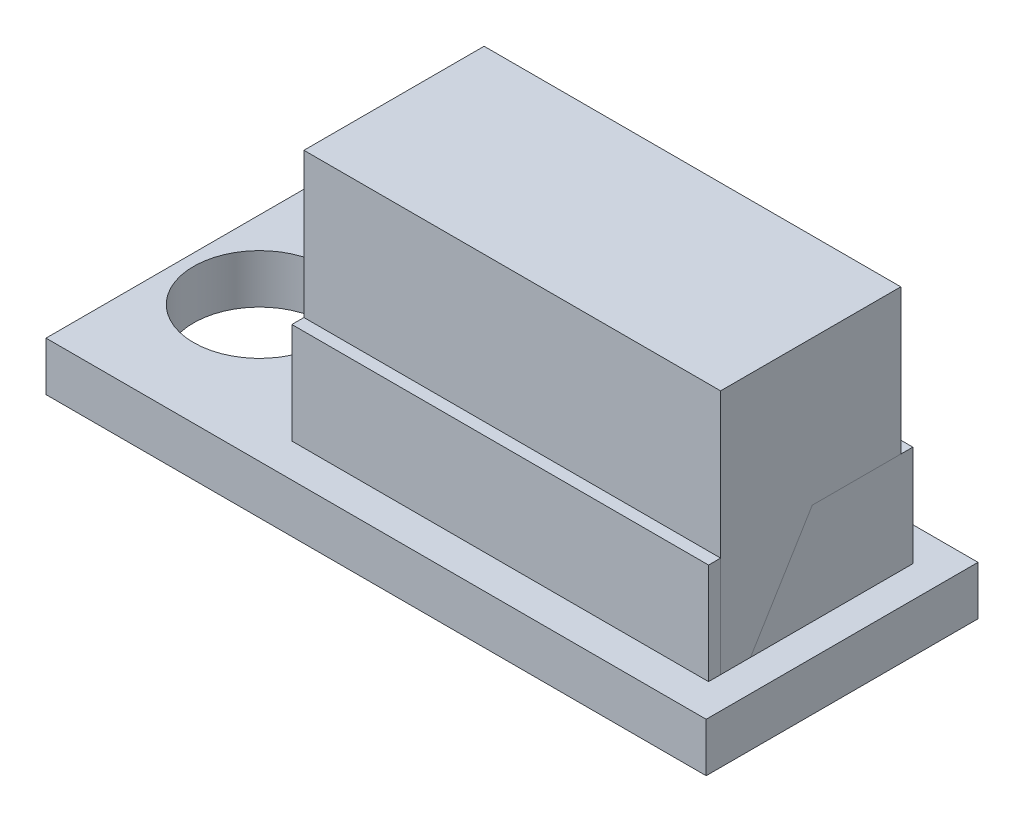
ISO-10303-21;
HEADER;
FILE_DESCRIPTION(('STEP AP214'),'2;1');
FILE_NAME('part.step','',(''),(''),'','','');
FILE_SCHEMA(('AUTOMOTIVE_DESIGN { 1 0 10303 214 1 1 1 1 }'));
ENDSEC;
DATA;
#1=APPLICATION_CONTEXT('core data for automotive mechanical design processes');
#2=APPLICATION_PROTOCOL_DEFINITION('international standard','automotive_design',2000,#1);
#3=PRODUCT_CONTEXT('',#1,'mechanical');
#4=PRODUCT('Part','Part','',(#3));
#5=PRODUCT_RELATED_PRODUCT_CATEGORY('part','',(#4));
#6=PRODUCT_DEFINITION_FORMATION('','',#4);
#7=PRODUCT_DEFINITION_CONTEXT('part definition',#1,'design');
#8=PRODUCT_DEFINITION('design','',#6,#7);
#9=PRODUCT_DEFINITION_SHAPE('','',#8);
#10=(LENGTH_UNIT() NAMED_UNIT(*) SI_UNIT(.MILLI.,.METRE.));
#11=(NAMED_UNIT(*) PLANE_ANGLE_UNIT() SI_UNIT($,.RADIAN.));
#12=(NAMED_UNIT(*) SI_UNIT($,.STERADIAN.) SOLID_ANGLE_UNIT());
#13=UNCERTAINTY_MEASURE_WITH_UNIT(LENGTH_MEASURE(1.E-05),#10,'distance_accuracy_value','');
#14=(GEOMETRIC_REPRESENTATION_CONTEXT(3) GLOBAL_UNCERTAINTY_ASSIGNED_CONTEXT((#13)) GLOBAL_UNIT_ASSIGNED_CONTEXT((#10,
#11,#12)) REPRESENTATION_CONTEXT('',''));
#15=CARTESIAN_POINT('',(0.,0.,0.));
#16=DIRECTION('',(0.,0.,1.));
#17=DIRECTION('',(1.,0.,0.));
#18=AXIS2_PLACEMENT_3D('',#15,#16,#17);
#19=CARTESIAN_POINT('',(-44.7585645073612,9.6393,17.5900974714582));
#20=DIRECTION('',(1.,0.,0.));
#21=DIRECTION('',(0.,0.,-1.));
#22=AXIS2_PLACEMENT_3D('',#19,#20,#21);
#23=PLANE('',#22);
#24=DIRECTION('',(0.,0.,1.));
#25=VECTOR('',#24,1.);
#26=CARTESIAN_POINT('',(-44.7585645073612,0.,17.5900974714582));
#27=LINE('',#26,#25);
#28=CARTESIAN_POINT('',(-44.7585645073612,0.,17.5900974714582));
#29=VERTEX_POINT('',#28);
#30=CARTESIAN_POINT('',(-44.7585645073612,0.,23.4828974714582));
#31=VERTEX_POINT('',#30);
#32=EDGE_CURVE('E105',#29,#31,#27,.T.);
#33=ORIENTED_EDGE('',*,*,#32,.T.);
#34=DIRECTION('',(0.,-1.,0.));
#35=VECTOR('',#34,1.);
#36=CARTESIAN_POINT('',(-44.7585645073612,9.6393,23.4828974714582));
#37=LINE('',#36,#35);
#38=CARTESIAN_POINT('',(-44.7585645073612,9.6393,23.4828974714582));
#39=VERTEX_POINT('',#38);
#40=EDGE_CURVE('E12',#39,#31,#37,.T.);
#41=ORIENTED_EDGE('',*,*,#40,.F.);
#42=DIRECTION('',(0.,0.,1.));
#43=VECTOR('',#42,1.);
#44=CARTESIAN_POINT('',(-44.7585645073612,9.6393,17.5900974714582));
#45=LINE('',#44,#43);
#46=CARTESIAN_POINT('',(-44.7585645073612,9.6393,17.5900974714582));
#47=VERTEX_POINT('',#46);
#48=EDGE_CURVE('E93',#47,#39,#45,.T.);
#49=ORIENTED_EDGE('',*,*,#48,.F.);
#50=DIRECTION('',(0.,-1.,0.));
#51=VECTOR('',#50,1.);
#52=CARTESIAN_POINT('',(-44.7585645073612,9.6393,17.5900974714582));
#53=LINE('',#52,#51);
#54=EDGE_CURVE('E101',#47,#29,#53,.T.);
#55=ORIENTED_EDGE('',*,*,#54,.T.);
#56=EDGE_LOOP('',(#33,#41,#49,#55));
#57=FACE_BOUND('',#56,.T.);
#58=ADVANCED_FACE('F42',(#57),#23,.F.);
#59=CARTESIAN_POINT('',(-44.7585645073612,9.6393,23.4828974714582));
#60=DIRECTION('',(0.,0.,-1.));
#61=DIRECTION('',(-1.,0.,0.));
#62=AXIS2_PLACEMENT_3D('',#59,#60,#61);
#63=PLANE('',#62);
#64=DIRECTION('',(1.,0.,0.));
#65=VECTOR('',#64,1.);
#66=CARTESIAN_POINT('',(-44.7585645073612,0.,23.4828974714582));
#67=LINE('',#66,#65);
#68=CARTESIAN_POINT('',(-31.1314645073612,0.,23.4828974714582));
#69=VERTEX_POINT('',#68);
#70=EDGE_CURVE('E97',#31,#69,#67,.T.);
#71=ORIENTED_EDGE('',*,*,#70,.T.);
#72=DIRECTION('',(0.,-1.,0.));
#73=VECTOR('',#72,1.);
#74=CARTESIAN_POINT('',(-31.1314645073612,9.6393,23.4828974714582));
#75=LINE('',#74,#73);
#76=CARTESIAN_POINT('',(-31.1314645073612,9.6393,23.4828974714582));
#77=VERTEX_POINT('',#76);
#78=EDGE_CURVE('E50',#77,#69,#75,.T.);
#79=ORIENTED_EDGE('',*,*,#78,.F.);
#80=DIRECTION('',(1.,0.,0.));
#81=VECTOR('',#80,1.);
#82=CARTESIAN_POINT('',(-44.7585645073612,9.6393,23.4828974714582));
#83=LINE('',#82,#81);
#84=EDGE_CURVE('E88',#39,#77,#83,.T.);
#85=ORIENTED_EDGE('',*,*,#84,.F.);
#86=ORIENTED_EDGE('',*,*,#40,.T.);
#87=EDGE_LOOP('',(#71,#79,#85,#86));
#88=FACE_BOUND('',#87,.T.);
#89=ADVANCED_FACE('F96',(#88),#63,.F.);
#90=CARTESIAN_POINT('',(-31.1314645073612,9.6393,17.5900974714582));
#91=DIRECTION('',(-1.,0.,0.));
#92=DIRECTION('',(0.,0.,1.));
#93=AXIS2_PLACEMENT_3D('',#90,#91,#92);
#94=PLANE('',#93);
#95=DIRECTION('',(0.,0.,-1.));
#96=VECTOR('',#95,1.);
#97=CARTESIAN_POINT('',(-31.1314645073612,0.,17.5900974714582));
#98=LINE('',#97,#96);
#99=CARTESIAN_POINT('',(-31.1314645073612,0.,17.5900974714582));
#100=VERTEX_POINT('',#99);
#101=EDGE_CURVE('E75',#69,#100,#98,.T.);
#102=ORIENTED_EDGE('',*,*,#101,.T.);
#103=DIRECTION('',(0.,-1.,0.));
#104=VECTOR('',#103,1.);
#105=CARTESIAN_POINT('',(-31.1314645073612,9.6393,17.5900974714582));
#106=LINE('',#105,#104);
#107=CARTESIAN_POINT('',(-31.1314645073612,9.6393,17.5900974714582));
#108=VERTEX_POINT('',#107);
#109=EDGE_CURVE('E98',#108,#100,#106,.T.);
#110=ORIENTED_EDGE('',*,*,#109,.F.);
#111=DIRECTION('',(0.,0.,-1.));
#112=VECTOR('',#111,1.);
#113=CARTESIAN_POINT('',(-31.1314645073612,9.6393,17.5900974714582));
#114=LINE('',#113,#112);
#115=EDGE_CURVE('E91',#77,#108,#114,.T.);
#116=ORIENTED_EDGE('',*,*,#115,.F.);
#117=ORIENTED_EDGE('',*,*,#78,.T.);
#118=EDGE_LOOP('',(#102,#110,#116,#117));
#119=FACE_BOUND('',#118,.T.);
#120=ADVANCED_FACE('F99',(#119),#94,.F.);
#121=CARTESIAN_POINT('',(-44.7585645073612,9.6393,17.5900974714582));
#122=DIRECTION('',(0.,0.,1.));
#123=DIRECTION('',(1.,0.,0.));
#124=AXIS2_PLACEMENT_3D('',#121,#122,#123);
#125=PLANE('',#124);
#126=DIRECTION('',(-1.,0.,0.));
#127=VECTOR('',#126,1.);
#128=CARTESIAN_POINT('',(-44.7585645073612,0.,17.5900974714582));
#129=LINE('',#128,#127);
#130=EDGE_CURVE('E81',#100,#29,#129,.T.);
#131=ORIENTED_EDGE('',*,*,#130,.T.);
#132=ORIENTED_EDGE('',*,*,#54,.F.);
#133=DIRECTION('',(-1.,0.,0.));
#134=VECTOR('',#133,1.);
#135=CARTESIAN_POINT('',(-44.7585645073612,9.6393,17.5900974714582));
#136=LINE('',#135,#134);
#137=EDGE_CURVE('E58',#108,#47,#136,.T.);
#138=ORIENTED_EDGE('',*,*,#137,.F.);
#139=ORIENTED_EDGE('',*,*,#109,.T.);
#140=EDGE_LOOP('',(#131,#132,#138,#139));
#141=FACE_BOUND('',#140,.T.);
#142=ADVANCED_FACE('F112',(#141),#125,.F.);
#143=CARTESIAN_POINT('',(0.,9.6393,0.));
#144=DIRECTION('',(0.,1.,0.));
#145=DIRECTION('',(0.,0.,1.));
#146=AXIS2_PLACEMENT_3D('',#143,#144,#145);
#147=PLANE('',#146);
#148=ORIENTED_EDGE('',*,*,#48,.T.);
#149=ORIENTED_EDGE('',*,*,#84,.T.);
#150=ORIENTED_EDGE('',*,*,#115,.T.);
#151=ORIENTED_EDGE('',*,*,#137,.T.);
#152=EDGE_LOOP('',(#148,#149,#150,#151));
#153=FACE_BOUND('',#152,.T.);
#154=ADVANCED_FACE('F89',(#153),#147,.T.);
#155=CARTESIAN_POINT('',(0.,0.,0.));
#156=DIRECTION('',(0.,1.,0.));
#157=DIRECTION('',(0.,0.,1.));
#158=AXIS2_PLACEMENT_3D('',#155,#156,#157);
#159=PLANE('',#158);
#160=ORIENTED_EDGE('',*,*,#32,.F.);
#161=ORIENTED_EDGE('',*,*,#130,.F.);
#162=ORIENTED_EDGE('',*,*,#101,.F.);
#163=ORIENTED_EDGE('',*,*,#70,.F.);
#164=EDGE_LOOP('',(#160,#161,#162,#163));
#165=FACE_BOUND('',#164,.T.);
#166=ADVANCED_FACE('F115',(#165),#159,.F.);
#167=CLOSED_SHELL('',(#58,#89,#120,#142,#154,#166));
#168=MANIFOLD_SOLID_BREP('B2',#167);
#169=CARTESIAN_POINT('',(0.,1.6002,0.));
#170=DIRECTION('',(0.,1.,0.));
#171=DIRECTION('',(0.,0.,1.));
#172=AXIS2_PLACEMENT_3D('',#169,#170,#171);
#173=PLANE('',#172);
#174=CARTESIAN_POINT('',(-49.1549913910025,1.6002,20.5364974714582));
#175=DIRECTION('',(0.,1.,0.));
#176=DIRECTION('',(0.,0.,1.));
#177=AXIS2_PLACEMENT_3D('',#174,#175,#176);
#178=CIRCLE('',#177,2.159);
#179=CARTESIAN_POINT('',(-49.1549913910025,1.6002,22.6954974714582));
#180=VERTEX_POINT('',#179);
#181=EDGE_CURVE('E277',#180,#180,#178,.T.);
#182=ORIENTED_EDGE('',*,*,#181,.F.);
#183=EDGE_LOOP('',(#182));
#184=FACE_BOUND('',#183,.T.);
#185=DIRECTION('',(0.,0.,1.));
#186=VECTOR('',#185,1.);
#187=CARTESIAN_POINT('',(-51.6949913910025,1.6002,16.0914974714582));
#188=LINE('',#187,#186);
#189=CARTESIAN_POINT('',(-51.6949913910025,1.6002,16.0914974714582));
#190=VERTEX_POINT('',#189);
#191=CARTESIAN_POINT('',(-51.6949913910025,1.6002,24.9814974714582));
#192=VERTEX_POINT('',#191);
#193=EDGE_CURVE('E283',#190,#192,#188,.T.);
#194=ORIENTED_EDGE('',*,*,#193,.T.);
#195=DIRECTION('',(1.,0.,0.));
#196=VECTOR('',#195,1.);
#197=CARTESIAN_POINT('',(-51.6949913910025,1.6002,24.9814974714582));
#198=LINE('',#197,#196);
#199=CARTESIAN_POINT('',(-30.1049913910025,1.6002,24.9814974714582));
#200=VERTEX_POINT('',#199);
#201=EDGE_CURVE('E217',#192,#200,#198,.T.);
#202=ORIENTED_EDGE('',*,*,#201,.T.);
#203=DIRECTION('',(0.,0.,-1.));
#204=VECTOR('',#203,1.);
#205=CARTESIAN_POINT('',(-30.1049913910025,1.6002,16.0914974714582));
#206=LINE('',#205,#204);
#207=CARTESIAN_POINT('',(-30.1049913910025,1.6002,16.0914974714582));
#208=VERTEX_POINT('',#207);
#209=EDGE_CURVE('E286',#200,#208,#206,.T.);
#210=ORIENTED_EDGE('',*,*,#209,.T.);
#211=DIRECTION('',(-1.,0.,0.));
#212=VECTOR('',#211,1.);
#213=CARTESIAN_POINT('',(-51.6949913910025,1.6002,16.0914974714582));
#214=LINE('',#213,#212);
#215=EDGE_CURVE('E189',#208,#190,#214,.T.);
#216=ORIENTED_EDGE('',*,*,#215,.T.);
#217=EDGE_LOOP('',(#194,#202,#210,#216));
#218=FACE_BOUND('',#217,.T.);
#219=DIRECTION('',(1.,0.,0.));
#220=VECTOR('',#219,1.);
#221=CARTESIAN_POINT('',(0.,1.6002,17.1963974714582));
#222=LINE('',#221,#220);
#223=CARTESIAN_POINT('',(-44.7585645073612,1.6002,17.1963974714582));
#224=VERTEX_POINT('',#223);
#225=CARTESIAN_POINT('',(-31.1314645073612,1.6002,17.1963974714582));
#226=VERTEX_POINT('',#225);
#227=EDGE_CURVE('E273',#224,#226,#222,.T.);
#228=ORIENTED_EDGE('',*,*,#227,.T.);
#229=DIRECTION('',(0.,0.,1.));
#230=VECTOR('',#229,1.);
#231=CARTESIAN_POINT('',(-31.1314645073612,1.6002,0.));
#232=LINE('',#231,#230);
#233=CARTESIAN_POINT('',(-31.1314645073612,1.6002,23.8765974714582));
#234=VERTEX_POINT('',#233);
#235=EDGE_CURVE('E262',#226,#234,#232,.T.);
#236=ORIENTED_EDGE('',*,*,#235,.T.);
#237=DIRECTION('',(-1.,0.,0.));
#238=VECTOR('',#237,1.);
#239=CARTESIAN_POINT('',(0.,1.6002,23.8765974714582));
#240=LINE('',#239,#238);
#241=CARTESIAN_POINT('',(-44.7585645073612,1.6002,23.8765974714582));
#242=VERTEX_POINT('',#241);
#243=EDGE_CURVE('E263',#234,#242,#240,.T.);
#244=ORIENTED_EDGE('',*,*,#243,.T.);
#245=DIRECTION('',(0.,0.,-1.));
#246=VECTOR('',#245,1.);
#247=CARTESIAN_POINT('',(-44.7585645073612,1.6002,0.));
#248=LINE('',#247,#246);
#249=EDGE_CURVE('E266',#242,#224,#248,.T.);
#250=ORIENTED_EDGE('',*,*,#249,.T.);
#251=EDGE_LOOP('',(#228,#236,#244,#250));
#252=FACE_BOUND('',#251,.T.);
#253=ADVANCED_FACE('F165',(#184,#218,#252),#173,.T.);
#254=CARTESIAN_POINT('',(0.,0.,0.));
#255=DIRECTION('',(0.,1.,0.));
#256=DIRECTION('',(0.,0.,1.));
#257=AXIS2_PLACEMENT_3D('',#254,#255,#256);
#258=PLANE('',#257);
#259=CARTESIAN_POINT('',(-49.1549913910025,0.,20.5364974714582));
#260=DIRECTION('',(0.,1.,0.));
#261=DIRECTION('',(0.,0.,1.));
#262=AXIS2_PLACEMENT_3D('',#259,#260,#261);
#263=CIRCLE('',#262,2.159);
#264=CARTESIAN_POINT('',(-49.1549913910025,0.,22.6954974714582));
#265=VERTEX_POINT('',#264);
#266=EDGE_CURVE('E276',#265,#265,#263,.T.);
#267=ORIENTED_EDGE('',*,*,#266,.T.);
#268=EDGE_LOOP('',(#267));
#269=FACE_BOUND('',#268,.T.);
#270=DIRECTION('',(0.,0.,1.));
#271=VECTOR('',#270,1.);
#272=CARTESIAN_POINT('',(-51.6949913910025,0.,16.0914974714582));
#273=LINE('',#272,#271);
#274=CARTESIAN_POINT('',(-51.6949913910025,0.,16.0914974714582));
#275=VERTEX_POINT('',#274);
#276=CARTESIAN_POINT('',(-51.6949913910025,0.,24.9814974714582));
#277=VERTEX_POINT('',#276);
#278=EDGE_CURVE('E280',#275,#277,#273,.T.);
#279=ORIENTED_EDGE('',*,*,#278,.F.);
#280=DIRECTION('',(-1.,0.,0.));
#281=VECTOR('',#280,1.);
#282=CARTESIAN_POINT('',(-51.6949913910025,0.,16.0914974714582));
#283=LINE('',#282,#281);
#284=CARTESIAN_POINT('',(-30.1049913910025,0.,16.0914974714582));
#285=VERTEX_POINT('',#284);
#286=EDGE_CURVE('E210',#285,#275,#283,.T.);
#287=ORIENTED_EDGE('',*,*,#286,.F.);
#288=DIRECTION('',(0.,0.,-1.));
#289=VECTOR('',#288,1.);
#290=CARTESIAN_POINT('',(-30.1049913910025,0.,16.0914974714582));
#291=LINE('',#290,#289);
#292=CARTESIAN_POINT('',(-30.1049913910025,0.,24.9814974714582));
#293=VERTEX_POINT('',#292);
#294=EDGE_CURVE('E294',#293,#285,#291,.T.);
#295=ORIENTED_EDGE('',*,*,#294,.F.);
#296=DIRECTION('',(1.,0.,0.));
#297=VECTOR('',#296,1.);
#298=CARTESIAN_POINT('',(-51.6949913910025,0.,24.9814974714582));
#299=LINE('',#298,#297);
#300=EDGE_CURVE('E292',#277,#293,#299,.T.);
#301=ORIENTED_EDGE('',*,*,#300,.F.);
#302=EDGE_LOOP('',(#279,#287,#295,#301));
#303=FACE_BOUND('',#302,.T.);
#304=ADVANCED_FACE('F307',(#269,#303),#258,.F.);
#305=CARTESIAN_POINT('',(-51.6949913910025,1.6002,16.0914974714582));
#306=DIRECTION('',(1.,0.,0.));
#307=DIRECTION('',(0.,0.,-1.));
#308=AXIS2_PLACEMENT_3D('',#305,#306,#307);
#309=PLANE('',#308);
#310=ORIENTED_EDGE('',*,*,#278,.T.);
#311=DIRECTION('',(0.,-1.,0.));
#312=VECTOR('',#311,1.);
#313=CARTESIAN_POINT('',(-51.6949913910025,1.6002,24.9814974714582));
#314=LINE('',#313,#312);
#315=EDGE_CURVE('E40',#192,#277,#314,.T.);
#316=ORIENTED_EDGE('',*,*,#315,.F.);
#317=ORIENTED_EDGE('',*,*,#193,.F.);
#318=DIRECTION('',(0.,-1.,0.));
#319=VECTOR('',#318,1.);
#320=CARTESIAN_POINT('',(-51.6949913910025,1.6002,16.0914974714582));
#321=LINE('',#320,#319);
#322=EDGE_CURVE('E289',#190,#275,#321,.T.);
#323=ORIENTED_EDGE('',*,*,#322,.T.);
#324=EDGE_LOOP('',(#310,#316,#317,#323));
#325=FACE_BOUND('',#324,.T.);
#326=ADVANCED_FACE('F167',(#325),#309,.F.);
#327=CARTESIAN_POINT('',(-51.6949913910025,1.6002,24.9814974714582));
#328=DIRECTION('',(0.,0.,-1.));
#329=DIRECTION('',(-1.,0.,0.));
#330=AXIS2_PLACEMENT_3D('',#327,#328,#329);
#331=PLANE('',#330);
#332=ORIENTED_EDGE('',*,*,#300,.T.);
#333=DIRECTION('',(0.,-1.,0.));
#334=VECTOR('',#333,1.);
#335=CARTESIAN_POINT('',(-30.1049913910025,1.6002,24.9814974714582));
#336=LINE('',#335,#334);
#337=EDGE_CURVE('E173',#200,#293,#336,.T.);
#338=ORIENTED_EDGE('',*,*,#337,.F.);
#339=ORIENTED_EDGE('',*,*,#201,.F.);
#340=ORIENTED_EDGE('',*,*,#315,.T.);
#341=EDGE_LOOP('',(#332,#338,#339,#340));
#342=FACE_BOUND('',#341,.T.);
#343=ADVANCED_FACE('F321',(#342),#331,.F.);
#344=CARTESIAN_POINT('',(-30.1049913910025,1.6002,16.0914974714582));
#345=DIRECTION('',(-1.,0.,0.));
#346=DIRECTION('',(0.,0.,1.));
#347=AXIS2_PLACEMENT_3D('',#344,#345,#346);
#348=PLANE('',#347);
#349=ORIENTED_EDGE('',*,*,#294,.T.);
#350=DIRECTION('',(0.,-1.,0.));
#351=VECTOR('',#350,1.);
#352=CARTESIAN_POINT('',(-30.1049913910025,1.6002,16.0914974714582));
#353=LINE('',#352,#351);
#354=EDGE_CURVE('E298',#208,#285,#353,.T.);
#355=ORIENTED_EDGE('',*,*,#354,.F.);
#356=ORIENTED_EDGE('',*,*,#209,.F.);
#357=ORIENTED_EDGE('',*,*,#337,.T.);
#358=EDGE_LOOP('',(#349,#355,#356,#357));
#359=FACE_BOUND('',#358,.T.);
#360=ADVANCED_FACE('F303',(#359),#348,.F.);
#361=CARTESIAN_POINT('',(-51.6949913910025,1.6002,16.0914974714582));
#362=DIRECTION('',(0.,0.,1.));
#363=DIRECTION('',(1.,0.,0.));
#364=AXIS2_PLACEMENT_3D('',#361,#362,#363);
#365=PLANE('',#364);
#366=ORIENTED_EDGE('',*,*,#286,.T.);
#367=ORIENTED_EDGE('',*,*,#322,.F.);
#368=ORIENTED_EDGE('',*,*,#215,.F.);
#369=ORIENTED_EDGE('',*,*,#354,.T.);
#370=EDGE_LOOP('',(#366,#367,#368,#369));
#371=FACE_BOUND('',#370,.T.);
#372=ADVANCED_FACE('F311',(#371),#365,.F.);
#373=CARTESIAN_POINT('',(-49.1549913910025,1.6002,20.5364974714582));
#374=DIRECTION('',(0.,-1.,0.));
#375=DIRECTION('',(0.,0.,-1.));
#376=AXIS2_PLACEMENT_3D('',#373,#374,#375);
#377=CYLINDRICAL_SURFACE('',#376,2.159);
#378=ORIENTED_EDGE('',*,*,#181,.T.);
#379=EDGE_LOOP('',(#378));
#380=FACE_BOUND('',#379,.T.);
#381=ORIENTED_EDGE('',*,*,#266,.F.);
#382=EDGE_LOOP('',(#381));
#383=FACE_BOUND('',#382,.T.);
#384=ADVANCED_FACE('F313',(#380,#383),#377,.F.);
#385=CARTESIAN_POINT('',(-31.1314645073612,4.9022,17.1963974714582));
#386=DIRECTION('',(-1.,0.,0.));
#387=DIRECTION('',(0.,0.,1.));
#388=AXIS2_PLACEMENT_3D('',#385,#386,#387);
#389=PLANE('',#388);
#390=ORIENTED_EDGE('',*,*,#235,.F.);
#391=DIRECTION('',(0.,-1.,0.));
#392=VECTOR('',#391,1.);
#393=CARTESIAN_POINT('',(-31.1314645073612,4.9022,17.1963974714582));
#394=LINE('',#393,#392);
#395=CARTESIAN_POINT('',(-31.1314645073612,4.9022,17.1963974714582));
#396=VERTEX_POINT('',#395);
#397=EDGE_CURVE('E244',#396,#226,#394,.T.);
#398=ORIENTED_EDGE('',*,*,#397,.F.);
#399=DIRECTION('',(0.,0.,-1.));
#400=VECTOR('',#399,1.);
#401=CARTESIAN_POINT('',(-31.1314645073612,4.9022,17.1963974714582));
#402=LINE('',#401,#400);
#403=CARTESIAN_POINT('',(-31.1314645073612,4.9022,23.8765974714582));
#404=VERTEX_POINT('',#403);
#405=EDGE_CURVE('E251',#404,#396,#402,.T.);
#406=ORIENTED_EDGE('',*,*,#405,.F.);
#407=DIRECTION('',(0.,-1.,0.));
#408=VECTOR('',#407,1.);
#409=CARTESIAN_POINT('',(-31.1314645073612,4.9022,23.8765974714582));
#410=LINE('',#409,#408);
#411=EDGE_CURVE('E415',#404,#234,#410,.T.);
#412=ORIENTED_EDGE('',*,*,#411,.T.);
#413=EDGE_LOOP('',(#390,#398,#406,#412));
#414=FACE_BOUND('',#413,.T.);
#415=ADVANCED_FACE('F260',(#414),#389,.F.);
#416=CARTESIAN_POINT('',(-31.1314645073612,4.9022,17.1963974714582));
#417=DIRECTION('',(0.,0.,1.));
#418=DIRECTION('',(1.,0.,0.));
#419=AXIS2_PLACEMENT_3D('',#416,#417,#418);
#420=PLANE('',#419);
#421=ORIENTED_EDGE('',*,*,#227,.F.);
#422=DIRECTION('',(0.,-1.,0.));
#423=VECTOR('',#422,1.);
#424=CARTESIAN_POINT('',(-44.7585645073612,4.9022,17.1963974714582));
#425=LINE('',#424,#423);
#426=CARTESIAN_POINT('',(-44.7585645073612,4.9022,17.1963974714582));
#427=VERTEX_POINT('',#426);
#428=EDGE_CURVE('E247',#427,#224,#425,.T.);
#429=ORIENTED_EDGE('',*,*,#428,.F.);
#430=DIRECTION('',(-1.,0.,0.));
#431=VECTOR('',#430,1.);
#432=CARTESIAN_POINT('',(-31.1314645073612,4.9022,17.1963974714582));
#433=LINE('',#432,#431);
#434=EDGE_CURVE('E240',#396,#427,#433,.T.);
#435=ORIENTED_EDGE('',*,*,#434,.F.);
#436=ORIENTED_EDGE('',*,*,#397,.T.);
#437=EDGE_LOOP('',(#421,#429,#435,#436));
#438=FACE_BOUND('',#437,.T.);
#439=ADVANCED_FACE('F242',(#438),#420,.F.);
#440=CARTESIAN_POINT('',(-44.7585645073612,4.9022,17.1963974714582));
#441=DIRECTION('',(1.,0.,0.));
#442=DIRECTION('',(0.,0.,-1.));
#443=AXIS2_PLACEMENT_3D('',#440,#441,#442);
#444=PLANE('',#443);
#445=ORIENTED_EDGE('',*,*,#249,.F.);
#446=DIRECTION('',(0.,-1.,0.));
#447=VECTOR('',#446,1.);
#448=CARTESIAN_POINT('',(-44.7585645073612,4.9022,23.8765974714582));
#449=LINE('',#448,#447);
#450=CARTESIAN_POINT('',(-44.7585645073612,4.9022,23.8765974714582));
#451=VERTEX_POINT('',#450);
#452=EDGE_CURVE('E180',#451,#242,#449,.T.);
#453=ORIENTED_EDGE('',*,*,#452,.F.);
#454=DIRECTION('',(0.,0.,1.));
#455=VECTOR('',#454,1.);
#456=CARTESIAN_POINT('',(-44.7585645073612,4.9022,17.1963974714582));
#457=LINE('',#456,#455);
#458=EDGE_CURVE('E250',#427,#451,#457,.T.);
#459=ORIENTED_EDGE('',*,*,#458,.F.);
#460=ORIENTED_EDGE('',*,*,#428,.T.);
#461=EDGE_LOOP('',(#445,#453,#459,#460));
#462=FACE_BOUND('',#461,.T.);
#463=ADVANCED_FACE('F337',(#462),#444,.F.);
#464=CARTESIAN_POINT('',(-31.1314645073612,4.9022,23.8765974714582));
#465=DIRECTION('',(0.,0.,-1.));
#466=DIRECTION('',(-1.,0.,0.));
#467=AXIS2_PLACEMENT_3D('',#464,#465,#466);
#468=PLANE('',#467);
#469=ORIENTED_EDGE('',*,*,#243,.F.);
#470=ORIENTED_EDGE('',*,*,#411,.F.);
#471=DIRECTION('',(1.,0.,0.));
#472=VECTOR('',#471,1.);
#473=CARTESIAN_POINT('',(-31.1314645073612,4.9022,23.8765974714582));
#474=LINE('',#473,#472);
#475=EDGE_CURVE('E255',#451,#404,#474,.T.);
#476=ORIENTED_EDGE('',*,*,#475,.F.);
#477=ORIENTED_EDGE('',*,*,#452,.T.);
#478=EDGE_LOOP('',(#469,#470,#476,#477));
#479=FACE_BOUND('',#478,.T.);
#480=ADVANCED_FACE('F340',(#479),#468,.F.);
#481=CARTESIAN_POINT('',(0.,4.9022,0.));
#482=DIRECTION('',(0.,-1.,0.));
#483=DIRECTION('',(0.,0.,-1.));
#484=AXIS2_PLACEMENT_3D('',#481,#482,#483);
#485=PLANE('',#484);
#486=ORIENTED_EDGE('',*,*,#405,.T.);
#487=ORIENTED_EDGE('',*,*,#434,.T.);
#488=ORIENTED_EDGE('',*,*,#458,.T.);
#489=ORIENTED_EDGE('',*,*,#475,.T.);
#490=EDGE_LOOP('',(#486,#487,#488,#489));
#491=FACE_BOUND('',#490,.T.);
#492=ADVANCED_FACE('F254',(#491),#485,.F.);
#493=CLOSED_SHELL('',(#253,#304,#326,#343,#360,#372,#384,#415,#439,#463,#480,#492));
#494=MANIFOLD_SOLID_BREP('B6',#493);
#495=ADVANCED_BREP_SHAPE_REPRESENTATION('',(#18,#168,#494),#14);
#496=SHAPE_DEFINITION_REPRESENTATION(#9,#495);
ENDSEC;
END-ISO-10303-21;
